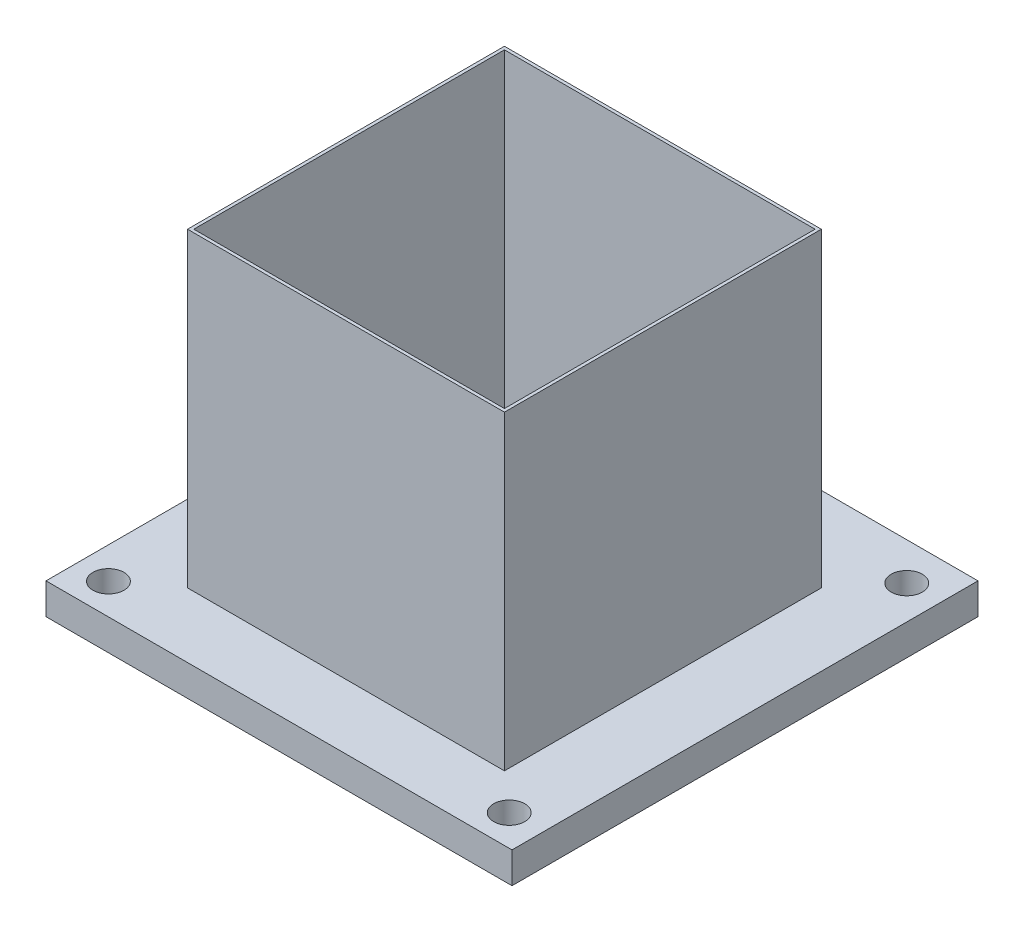
ISO-10303-21;
HEADER;
FILE_DESCRIPTION(('STEP AP214'),'2;1');
FILE_NAME('part.step','',(''),(''),'','','');
FILE_SCHEMA(('AUTOMOTIVE_DESIGN { 1 0 10303 214 1 1 1 1 }'));
ENDSEC;
DATA;
#1=APPLICATION_CONTEXT('core data for automotive mechanical design processes');
#2=APPLICATION_PROTOCOL_DEFINITION('international standard','automotive_design',2000,#1);
#3=PRODUCT_CONTEXT('',#1,'mechanical');
#4=PRODUCT('Part','Part','',(#3));
#5=PRODUCT_RELATED_PRODUCT_CATEGORY('part','',(#4));
#6=PRODUCT_DEFINITION_FORMATION('','',#4);
#7=PRODUCT_DEFINITION_CONTEXT('part definition',#1,'design');
#8=PRODUCT_DEFINITION('design','',#6,#7);
#9=PRODUCT_DEFINITION_SHAPE('','',#8);
#10=(LENGTH_UNIT() NAMED_UNIT(*) SI_UNIT(.MILLI.,.METRE.));
#11=(NAMED_UNIT(*) PLANE_ANGLE_UNIT() SI_UNIT($,.RADIAN.));
#12=(NAMED_UNIT(*) SI_UNIT($,.STERADIAN.) SOLID_ANGLE_UNIT());
#13=UNCERTAINTY_MEASURE_WITH_UNIT(LENGTH_MEASURE(1.E-05),#10,'distance_accuracy_value','');
#14=(GEOMETRIC_REPRESENTATION_CONTEXT(3) GLOBAL_UNCERTAINTY_ASSIGNED_CONTEXT((#13)) GLOBAL_UNIT_ASSIGNED_CONTEXT((#10,
#11,#12)) REPRESENTATION_CONTEXT('',''));
#15=CARTESIAN_POINT('',(0.,0.,0.));
#16=DIRECTION('',(0.,0.,1.));
#17=DIRECTION('',(1.,0.,0.));
#18=AXIS2_PLACEMENT_3D('',#15,#16,#17);
#19=CARTESIAN_POINT('',(0.,2.54,0.));
#20=DIRECTION('',(0.,-1.,0.));
#21=DIRECTION('',(0.,0.,-1.));
#22=AXIS2_PLACEMENT_3D('',#19,#20,#21);
#23=PLANE('',#22);
#24=CARTESIAN_POINT('',(2.58471853738159,2.54,-2.52040180034529));
#25=DIRECTION('',(0.,1.,0.));
#26=DIRECTION('',(0.,0.,1.));
#27=AXIS2_PLACEMENT_3D('',#24,#25,#26);
#28=CIRCLE('',#27,1.27);
#29=CARTESIAN_POINT('',(2.58471853738159,2.54,-1.25040180034529));
#30=VERTEX_POINT('',#29);
#31=EDGE_CURVE('E181',#30,#30,#28,.T.);
#32=ORIENTED_EDGE('',*,*,#31,.F.);
#33=EDGE_LOOP('',(#32));
#34=FACE_BOUND('',#33,.T.);
#35=CARTESIAN_POINT('',(35.3509562519498,2.54,-2.52040180034529));
#36=DIRECTION('',(0.,1.,0.));
#37=DIRECTION('',(0.,0.,1.));
#38=AXIS2_PLACEMENT_3D('',#35,#36,#37);
#39=CIRCLE('',#38,1.27);
#40=CARTESIAN_POINT('',(35.3509562519498,2.54,-1.25040180034529));
#41=VERTEX_POINT('',#40);
#42=EDGE_CURVE('E187',#41,#41,#39,.T.);
#43=ORIENTED_EDGE('',*,*,#42,.F.);
#44=EDGE_LOOP('',(#43));
#45=FACE_BOUND('',#44,.T.);
#46=CARTESIAN_POINT('',(35.3509562519498,2.54,-35.0229825900215));
#47=DIRECTION('',(0.,1.,0.));
#48=DIRECTION('',(0.,0.,1.));
#49=AXIS2_PLACEMENT_3D('',#46,#47,#48);
#50=CIRCLE('',#49,1.27);
#51=CARTESIAN_POINT('',(35.3509562519498,2.54,-33.7529825900215));
#52=VERTEX_POINT('',#51);
#53=EDGE_CURVE('E193',#52,#52,#50,.T.);
#54=ORIENTED_EDGE('',*,*,#53,.F.);
#55=EDGE_LOOP('',(#54));
#56=FACE_BOUND('',#55,.T.);
#57=CARTESIAN_POINT('',(2.58471853738159,2.54,-35.0229825900215));
#58=DIRECTION('',(0.,1.,0.));
#59=DIRECTION('',(0.,0.,1.));
#60=AXIS2_PLACEMENT_3D('',#57,#58,#59);
#61=CIRCLE('',#60,1.27);
#62=CARTESIAN_POINT('',(2.58471853738159,2.54,-33.7529825900215));
#63=VERTEX_POINT('',#62);
#64=EDGE_CURVE('E199',#63,#63,#61,.T.);
#65=ORIENTED_EDGE('',*,*,#64,.F.);
#66=EDGE_LOOP('',(#65));
#67=FACE_BOUND('',#66,.T.);
#68=DIRECTION('',(0.,0.,1.));
#69=VECTOR('',#68,1.);
#70=CARTESIAN_POINT('',(0.,2.54,0.));
#71=LINE('',#70,#69);
#72=CARTESIAN_POINT('',(0.,2.54,-38.1));
#73=VERTEX_POINT('',#72);
#74=CARTESIAN_POINT('',(0.,2.54,0.));
#75=VERTEX_POINT('',#74);
#76=EDGE_CURVE('E217',#73,#75,#71,.T.);
#77=ORIENTED_EDGE('',*,*,#76,.T.);
#78=DIRECTION('',(1.,0.,0.));
#79=VECTOR('',#78,1.);
#80=CARTESIAN_POINT('',(0.,2.54,0.));
#81=LINE('',#80,#79);
#82=CARTESIAN_POINT('',(38.1,2.54,0.));
#83=VERTEX_POINT('',#82);
#84=EDGE_CURVE('E220',#75,#83,#81,.T.);
#85=ORIENTED_EDGE('',*,*,#84,.T.);
#86=DIRECTION('',(0.,0.,-1.));
#87=VECTOR('',#86,1.);
#88=CARTESIAN_POINT('',(38.1,2.54,0.));
#89=LINE('',#88,#87);
#90=CARTESIAN_POINT('',(38.1,2.54,-38.1));
#91=VERTEX_POINT('',#90);
#92=EDGE_CURVE('E223',#83,#91,#89,.T.);
#93=ORIENTED_EDGE('',*,*,#92,.T.);
#94=DIRECTION('',(-1.,0.,0.));
#95=VECTOR('',#94,1.);
#96=CARTESIAN_POINT('',(0.,2.54,-38.1));
#97=LINE('',#96,#95);
#98=EDGE_CURVE('E225',#91,#73,#97,.T.);
#99=ORIENTED_EDGE('',*,*,#98,.T.);
#100=EDGE_LOOP('',(#77,#85,#93,#99));
#101=FACE_BOUND('',#100,.T.);
#102=DIRECTION('',(0.,0.,1.));
#103=VECTOR('',#102,1.);
#104=CARTESIAN_POINT('',(6.28776886791902,2.54,-31.1935027995673));
#105=LINE('',#104,#103);
#106=CARTESIAN_POINT('',(6.28776886791902,2.54,-31.1935027995673));
#107=VERTEX_POINT('',#106);
#108=CARTESIAN_POINT('',(6.28776886791902,2.54,-5.28550279956734));
#109=VERTEX_POINT('',#108);
#110=EDGE_CURVE('E152',#107,#109,#105,.T.);
#111=ORIENTED_EDGE('',*,*,#110,.F.);
#112=DIRECTION('',(-1.,0.,0.));
#113=VECTOR('',#112,1.);
#114=CARTESIAN_POINT('',(6.28776886791902,2.54,-31.1935027995673));
#115=LINE('',#114,#113);
#116=CARTESIAN_POINT('',(32.195768867919,2.54,-31.1935027995673));
#117=VERTEX_POINT('',#116);
#118=EDGE_CURVE('E157',#117,#107,#115,.T.);
#119=ORIENTED_EDGE('',*,*,#118,.F.);
#120=DIRECTION('',(0.,0.,-1.));
#121=VECTOR('',#120,1.);
#122=CARTESIAN_POINT('',(32.195768867919,2.54,-31.1935027995673));
#123=LINE('',#122,#121);
#124=CARTESIAN_POINT('',(32.195768867919,2.54,-5.28550279956734));
#125=VERTEX_POINT('',#124);
#126=EDGE_CURVE('E55',#125,#117,#123,.T.);
#127=ORIENTED_EDGE('',*,*,#126,.F.);
#128=DIRECTION('',(1.,0.,0.));
#129=VECTOR('',#128,1.);
#130=CARTESIAN_POINT('',(6.28776886791902,2.54,-5.28550279956734));
#131=LINE('',#130,#129);
#132=EDGE_CURVE('E50',#109,#125,#131,.T.);
#133=ORIENTED_EDGE('',*,*,#132,.F.);
#134=EDGE_LOOP('',(#111,#119,#127,#133));
#135=FACE_BOUND('',#134,.T.);
#136=ADVANCED_FACE('F35',(#34,#45,#56,#67,#101,#135),#23,.F.);
#137=CARTESIAN_POINT('',(0.,0.,0.));
#138=DIRECTION('',(0.,-1.,0.));
#139=DIRECTION('',(0.,0.,-1.));
#140=AXIS2_PLACEMENT_3D('',#137,#138,#139);
#141=PLANE('',#140);
#142=CARTESIAN_POINT('',(35.3509562519498,0.,-2.52040180034529));
#143=DIRECTION('',(0.,1.,0.));
#144=DIRECTION('',(0.,0.,1.));
#145=AXIS2_PLACEMENT_3D('',#142,#143,#144);
#146=CIRCLE('',#145,1.27);
#147=CARTESIAN_POINT('',(35.3509562519498,0.,-1.25040180034529));
#148=VERTEX_POINT('',#147);
#149=EDGE_CURVE('E184',#148,#148,#146,.T.);
#150=ORIENTED_EDGE('',*,*,#149,.T.);
#151=EDGE_LOOP('',(#150));
#152=FACE_BOUND('',#151,.T.);
#153=CARTESIAN_POINT('',(2.58471853738159,0.,-35.0229825900215));
#154=DIRECTION('',(0.,1.,0.));
#155=DIRECTION('',(0.,0.,1.));
#156=AXIS2_PLACEMENT_3D('',#153,#154,#155);
#157=CIRCLE('',#156,1.27);
#158=CARTESIAN_POINT('',(2.58471853738159,0.,-33.7529825900215));
#159=VERTEX_POINT('',#158);
#160=EDGE_CURVE('E196',#159,#159,#157,.T.);
#161=ORIENTED_EDGE('',*,*,#160,.T.);
#162=EDGE_LOOP('',(#161));
#163=FACE_BOUND('',#162,.T.);
#164=DIRECTION('',(0.,0.,1.));
#165=VECTOR('',#164,1.);
#166=CARTESIAN_POINT('',(0.,0.,0.));
#167=LINE('',#166,#165);
#168=CARTESIAN_POINT('',(0.,0.,-38.1));
#169=VERTEX_POINT('',#168);
#170=CARTESIAN_POINT('',(0.,0.,0.));
#171=VERTEX_POINT('',#170);
#172=EDGE_CURVE('E132',#169,#171,#167,.T.);
#173=ORIENTED_EDGE('',*,*,#172,.F.);
#174=DIRECTION('',(-1.,0.,0.));
#175=VECTOR('',#174,1.);
#176=CARTESIAN_POINT('',(0.,0.,-38.1));
#177=LINE('',#176,#175);
#178=CARTESIAN_POINT('',(38.1,0.,-38.1));
#179=VERTEX_POINT('',#178);
#180=EDGE_CURVE('E221',#179,#169,#177,.T.);
#181=ORIENTED_EDGE('',*,*,#180,.F.);
#182=DIRECTION('',(0.,0.,-1.));
#183=VECTOR('',#182,1.);
#184=CARTESIAN_POINT('',(38.1,0.,0.));
#185=LINE('',#184,#183);
#186=CARTESIAN_POINT('',(38.1,0.,0.));
#187=VERTEX_POINT('',#186);
#188=EDGE_CURVE('E232',#187,#179,#185,.T.);
#189=ORIENTED_EDGE('',*,*,#188,.F.);
#190=DIRECTION('',(1.,0.,0.));
#191=VECTOR('',#190,1.);
#192=CARTESIAN_POINT('',(0.,0.,0.));
#193=LINE('',#192,#191);
#194=EDGE_CURVE('E230',#171,#187,#193,.T.);
#195=ORIENTED_EDGE('',*,*,#194,.F.);
#196=EDGE_LOOP('',(#173,#181,#189,#195));
#197=FACE_BOUND('',#196,.T.);
#198=DIRECTION('',(-1.,0.,0.));
#199=VECTOR('',#198,1.);
#200=CARTESIAN_POINT('',(6.54176886791902,0.,-30.9395027995673));
#201=LINE('',#200,#199);
#202=CARTESIAN_POINT('',(31.941768867919,0.,-30.9395027995673));
#203=VERTEX_POINT('',#202);
#204=CARTESIAN_POINT('',(6.54176886791902,0.,-30.9395027995673));
#205=VERTEX_POINT('',#204);
#206=EDGE_CURVE('E210',#203,#205,#201,.T.);
#207=ORIENTED_EDGE('',*,*,#206,.T.);
#208=DIRECTION('',(0.,0.,1.));
#209=VECTOR('',#208,1.);
#210=CARTESIAN_POINT('',(6.54176886791902,0.,-30.9395027995673));
#211=LINE('',#210,#209);
#212=CARTESIAN_POINT('',(6.54176886791902,0.,-5.53950279956734));
#213=VERTEX_POINT('',#212);
#214=EDGE_CURVE('E202',#205,#213,#211,.T.);
#215=ORIENTED_EDGE('',*,*,#214,.T.);
#216=DIRECTION('',(1.,0.,0.));
#217=VECTOR('',#216,1.);
#218=CARTESIAN_POINT('',(6.54176886791902,0.,-5.53950279956734));
#219=LINE('',#218,#217);
#220=CARTESIAN_POINT('',(31.941768867919,0.,-5.53950279956734));
#221=VERTEX_POINT('',#220);
#222=EDGE_CURVE('E129',#213,#221,#219,.T.);
#223=ORIENTED_EDGE('',*,*,#222,.T.);
#224=DIRECTION('',(0.,0.,-1.));
#225=VECTOR('',#224,1.);
#226=CARTESIAN_POINT('',(31.941768867919,0.,-30.9395027995673));
#227=LINE('',#226,#225);
#228=EDGE_CURVE('E207',#221,#203,#227,.T.);
#229=ORIENTED_EDGE('',*,*,#228,.T.);
#230=EDGE_LOOP('',(#207,#215,#223,#229));
#231=FACE_BOUND('',#230,.T.);
#232=CARTESIAN_POINT('',(35.3509562519498,0.,-35.0229825900215));
#233=DIRECTION('',(0.,1.,0.));
#234=DIRECTION('',(0.,0.,1.));
#235=AXIS2_PLACEMENT_3D('',#232,#233,#234);
#236=CIRCLE('',#235,1.27);
#237=CARTESIAN_POINT('',(35.3509562519498,0.,-33.7529825900215));
#238=VERTEX_POINT('',#237);
#239=EDGE_CURVE('E190',#238,#238,#236,.T.);
#240=ORIENTED_EDGE('',*,*,#239,.T.);
#241=EDGE_LOOP('',(#240));
#242=FACE_BOUND('',#241,.T.);
#243=CARTESIAN_POINT('',(2.58471853738159,0.,-2.52040180034529));
#244=DIRECTION('',(0.,1.,0.));
#245=DIRECTION('',(0.,0.,1.));
#246=AXIS2_PLACEMENT_3D('',#243,#244,#245);
#247=CIRCLE('',#246,1.27);
#248=CARTESIAN_POINT('',(2.58471853738159,0.,-1.25040180034529));
#249=VERTEX_POINT('',#248);
#250=EDGE_CURVE('E180',#249,#249,#247,.T.);
#251=ORIENTED_EDGE('',*,*,#250,.T.);
#252=EDGE_LOOP('',(#251));
#253=FACE_BOUND('',#252,.T.);
#254=ADVANCED_FACE('F250',(#152,#163,#197,#231,#242,#253),#141,.T.);
#255=CARTESIAN_POINT('',(0.,2.54,0.));
#256=DIRECTION('',(1.,0.,0.));
#257=DIRECTION('',(0.,0.,-1.));
#258=AXIS2_PLACEMENT_3D('',#255,#256,#257);
#259=PLANE('',#258);
#260=ORIENTED_EDGE('',*,*,#172,.T.);
#261=DIRECTION('',(0.,-1.,0.));
#262=VECTOR('',#261,1.);
#263=CARTESIAN_POINT('',(0.,2.54,0.));
#264=LINE('',#263,#262);
#265=EDGE_CURVE('E11',#75,#171,#264,.T.);
#266=ORIENTED_EDGE('',*,*,#265,.F.);
#267=ORIENTED_EDGE('',*,*,#76,.F.);
#268=DIRECTION('',(0.,-1.,0.));
#269=VECTOR('',#268,1.);
#270=CARTESIAN_POINT('',(0.,2.54,-38.1));
#271=LINE('',#270,#269);
#272=EDGE_CURVE('E227',#73,#169,#271,.T.);
#273=ORIENTED_EDGE('',*,*,#272,.T.);
#274=EDGE_LOOP('',(#260,#266,#267,#273));
#275=FACE_BOUND('',#274,.T.);
#276=ADVANCED_FACE('F37',(#275),#259,.F.);
#277=CARTESIAN_POINT('',(0.,2.54,0.));
#278=DIRECTION('',(0.,0.,-1.));
#279=DIRECTION('',(-1.,0.,0.));
#280=AXIS2_PLACEMENT_3D('',#277,#278,#279);
#281=PLANE('',#280);
#282=ORIENTED_EDGE('',*,*,#194,.T.);
#283=DIRECTION('',(0.,-1.,0.));
#284=VECTOR('',#283,1.);
#285=CARTESIAN_POINT('',(38.1,2.54,0.));
#286=LINE('',#285,#284);
#287=EDGE_CURVE('E43',#83,#187,#286,.T.);
#288=ORIENTED_EDGE('',*,*,#287,.F.);
#289=ORIENTED_EDGE('',*,*,#84,.F.);
#290=ORIENTED_EDGE('',*,*,#265,.T.);
#291=EDGE_LOOP('',(#282,#288,#289,#290));
#292=FACE_BOUND('',#291,.T.);
#293=ADVANCED_FACE('F260',(#292),#281,.F.);
#294=CARTESIAN_POINT('',(38.1,2.54,0.));
#295=DIRECTION('',(-1.,0.,0.));
#296=DIRECTION('',(0.,0.,1.));
#297=AXIS2_PLACEMENT_3D('',#294,#295,#296);
#298=PLANE('',#297);
#299=ORIENTED_EDGE('',*,*,#188,.T.);
#300=DIRECTION('',(0.,-1.,0.));
#301=VECTOR('',#300,1.);
#302=CARTESIAN_POINT('',(38.1,2.54,-38.1));
#303=LINE('',#302,#301);
#304=EDGE_CURVE('E237',#91,#179,#303,.T.);
#305=ORIENTED_EDGE('',*,*,#304,.F.);
#306=ORIENTED_EDGE('',*,*,#92,.F.);
#307=ORIENTED_EDGE('',*,*,#287,.T.);
#308=EDGE_LOOP('',(#299,#305,#306,#307));
#309=FACE_BOUND('',#308,.T.);
#310=ADVANCED_FACE('F244',(#309),#298,.F.);
#311=CARTESIAN_POINT('',(0.,2.54,-38.1));
#312=DIRECTION('',(0.,0.,1.));
#313=DIRECTION('',(1.,0.,0.));
#314=AXIS2_PLACEMENT_3D('',#311,#312,#313);
#315=PLANE('',#314);
#316=ORIENTED_EDGE('',*,*,#180,.T.);
#317=ORIENTED_EDGE('',*,*,#272,.F.);
#318=ORIENTED_EDGE('',*,*,#98,.F.);
#319=ORIENTED_EDGE('',*,*,#304,.T.);
#320=EDGE_LOOP('',(#316,#317,#318,#319));
#321=FACE_BOUND('',#320,.T.);
#322=ADVANCED_FACE('F254',(#321),#315,.F.);
#323=CARTESIAN_POINT('',(6.54176886791902,2.54,-30.9395027995673));
#324=DIRECTION('',(1.,0.,0.));
#325=DIRECTION('',(0.,0.,-1.));
#326=AXIS2_PLACEMENT_3D('',#323,#324,#325);
#327=PLANE('',#326);
#328=ORIENTED_EDGE('',*,*,#214,.F.);
#329=DIRECTION('',(0.,-1.,0.));
#330=VECTOR('',#329,1.);
#331=CARTESIAN_POINT('',(6.54176886791902,2.54,-30.9395027995673));
#332=LINE('',#331,#330);
#333=CARTESIAN_POINT('',(6.54176886791902,27.94,-30.9395027995673));
#334=VERTEX_POINT('',#333);
#335=EDGE_CURVE('E139',#334,#205,#332,.T.);
#336=ORIENTED_EDGE('',*,*,#335,.F.);
#337=DIRECTION('',(0.,0.,1.));
#338=VECTOR('',#337,1.);
#339=CARTESIAN_POINT('',(6.54176886791902,27.94,-30.9395027995673));
#340=LINE('',#339,#338);
#341=CARTESIAN_POINT('',(6.54176886791902,27.94,-5.53950279956734));
#342=VERTEX_POINT('',#341);
#343=EDGE_CURVE('E136',#334,#342,#340,.T.);
#344=ORIENTED_EDGE('',*,*,#343,.T.);
#345=DIRECTION('',(0.,-1.,0.));
#346=VECTOR('',#345,1.);
#347=CARTESIAN_POINT('',(6.54176886791902,2.54,-5.53950279956734));
#348=LINE('',#347,#346);
#349=EDGE_CURVE('E122',#342,#213,#348,.T.);
#350=ORIENTED_EDGE('',*,*,#349,.T.);
#351=EDGE_LOOP('',(#328,#336,#344,#350));
#352=FACE_BOUND('',#351,.T.);
#353=ADVANCED_FACE('F137',(#352),#327,.T.);
#354=CARTESIAN_POINT('',(6.54176886791902,2.54,-5.53950279956734));
#355=DIRECTION('',(0.,0.,-1.));
#356=DIRECTION('',(-1.,0.,0.));
#357=AXIS2_PLACEMENT_3D('',#354,#355,#356);
#358=PLANE('',#357);
#359=ORIENTED_EDGE('',*,*,#222,.F.);
#360=ORIENTED_EDGE('',*,*,#349,.F.);
#361=DIRECTION('',(1.,0.,0.));
#362=VECTOR('',#361,1.);
#363=CARTESIAN_POINT('',(6.54176886791902,27.94,-5.53950279956734));
#364=LINE('',#363,#362);
#365=CARTESIAN_POINT('',(31.941768867919,27.94,-5.53950279956734));
#366=VERTEX_POINT('',#365);
#367=EDGE_CURVE('E126',#342,#366,#364,.T.);
#368=ORIENTED_EDGE('',*,*,#367,.T.);
#369=DIRECTION('',(0.,-1.,0.));
#370=VECTOR('',#369,1.);
#371=CARTESIAN_POINT('',(31.941768867919,2.54,-5.53950279956734));
#372=LINE('',#371,#370);
#373=EDGE_CURVE('E133',#366,#221,#372,.T.);
#374=ORIENTED_EDGE('',*,*,#373,.T.);
#375=EDGE_LOOP('',(#359,#360,#368,#374));
#376=FACE_BOUND('',#375,.T.);
#377=ADVANCED_FACE('F124',(#376),#358,.T.);
#378=CARTESIAN_POINT('',(31.941768867919,2.54,-30.9395027995673));
#379=DIRECTION('',(-1.,0.,0.));
#380=DIRECTION('',(0.,0.,1.));
#381=AXIS2_PLACEMENT_3D('',#378,#379,#380);
#382=PLANE('',#381);
#383=ORIENTED_EDGE('',*,*,#228,.F.);
#384=ORIENTED_EDGE('',*,*,#373,.F.);
#385=DIRECTION('',(0.,0.,-1.));
#386=VECTOR('',#385,1.);
#387=CARTESIAN_POINT('',(31.941768867919,27.94,-30.9395027995673));
#388=LINE('',#387,#386);
#389=CARTESIAN_POINT('',(31.941768867919,27.94,-30.9395027995673));
#390=VERTEX_POINT('',#389);
#391=EDGE_CURVE('E146',#366,#390,#388,.T.);
#392=ORIENTED_EDGE('',*,*,#391,.T.);
#393=DIRECTION('',(0.,-1.,0.));
#394=VECTOR('',#393,1.);
#395=CARTESIAN_POINT('',(31.941768867919,2.54,-30.9395027995673));
#396=LINE('',#395,#394);
#397=EDGE_CURVE('E214',#390,#203,#396,.T.);
#398=ORIENTED_EDGE('',*,*,#397,.T.);
#399=EDGE_LOOP('',(#383,#384,#392,#398));
#400=FACE_BOUND('',#399,.T.);
#401=ADVANCED_FACE('F287',(#400),#382,.T.);
#402=CARTESIAN_POINT('',(6.54176886791902,2.54,-30.9395027995673));
#403=DIRECTION('',(0.,0.,1.));
#404=DIRECTION('',(1.,0.,0.));
#405=AXIS2_PLACEMENT_3D('',#402,#403,#404);
#406=PLANE('',#405);
#407=ORIENTED_EDGE('',*,*,#206,.F.);
#408=ORIENTED_EDGE('',*,*,#397,.F.);
#409=DIRECTION('',(-1.,0.,0.));
#410=VECTOR('',#409,1.);
#411=CARTESIAN_POINT('',(6.54176886791902,27.94,-30.9395027995673));
#412=LINE('',#411,#410);
#413=EDGE_CURVE('E148',#390,#334,#412,.T.);
#414=ORIENTED_EDGE('',*,*,#413,.T.);
#415=ORIENTED_EDGE('',*,*,#335,.T.);
#416=EDGE_LOOP('',(#407,#408,#414,#415));
#417=FACE_BOUND('',#416,.T.);
#418=ADVANCED_FACE('F291',(#417),#406,.T.);
#419=CARTESIAN_POINT('',(2.58471853738159,2.54,-35.0229825900215));
#420=DIRECTION('',(0.,-1.,0.));
#421=DIRECTION('',(0.,0.,-1.));
#422=AXIS2_PLACEMENT_3D('',#419,#420,#421);
#423=CYLINDRICAL_SURFACE('',#422,1.27);
#424=ORIENTED_EDGE('',*,*,#64,.T.);
#425=EDGE_LOOP('',(#424));
#426=FACE_BOUND('',#425,.T.);
#427=ORIENTED_EDGE('',*,*,#160,.F.);
#428=EDGE_LOOP('',(#427));
#429=FACE_BOUND('',#428,.T.);
#430=ADVANCED_FACE('F297',(#426,#429),#423,.F.);
#431=CARTESIAN_POINT('',(35.3509562519498,2.54,-35.0229825900215));
#432=DIRECTION('',(0.,-1.,0.));
#433=DIRECTION('',(0.,0.,-1.));
#434=AXIS2_PLACEMENT_3D('',#431,#432,#433);
#435=CYLINDRICAL_SURFACE('',#434,1.27);
#436=ORIENTED_EDGE('',*,*,#53,.T.);
#437=EDGE_LOOP('',(#436));
#438=FACE_BOUND('',#437,.T.);
#439=ORIENTED_EDGE('',*,*,#239,.F.);
#440=EDGE_LOOP('',(#439));
#441=FACE_BOUND('',#440,.T.);
#442=ADVANCED_FACE('F301',(#438,#441),#435,.F.);
#443=CARTESIAN_POINT('',(35.3509562519498,2.54,-2.52040180034529));
#444=DIRECTION('',(0.,-1.,0.));
#445=DIRECTION('',(0.,0.,-1.));
#446=AXIS2_PLACEMENT_3D('',#443,#444,#445);
#447=CYLINDRICAL_SURFACE('',#446,1.27);
#448=ORIENTED_EDGE('',*,*,#42,.T.);
#449=EDGE_LOOP('',(#448));
#450=FACE_BOUND('',#449,.T.);
#451=ORIENTED_EDGE('',*,*,#149,.F.);
#452=EDGE_LOOP('',(#451));
#453=FACE_BOUND('',#452,.T.);
#454=ADVANCED_FACE('F305',(#450,#453),#447,.F.);
#455=CARTESIAN_POINT('',(2.58471853738159,2.54,-2.52040180034529));
#456=DIRECTION('',(0.,-1.,0.));
#457=DIRECTION('',(0.,0.,-1.));
#458=AXIS2_PLACEMENT_3D('',#455,#456,#457);
#459=CYLINDRICAL_SURFACE('',#458,1.27);
#460=ORIENTED_EDGE('',*,*,#31,.T.);
#461=EDGE_LOOP('',(#460));
#462=FACE_BOUND('',#461,.T.);
#463=ORIENTED_EDGE('',*,*,#250,.F.);
#464=EDGE_LOOP('',(#463));
#465=FACE_BOUND('',#464,.T.);
#466=ADVANCED_FACE('F309',(#462,#465),#459,.F.);
#467=CARTESIAN_POINT('',(0.,27.94,0.));
#468=DIRECTION('',(0.,1.,0.));
#469=DIRECTION('',(0.,0.,1.));
#470=AXIS2_PLACEMENT_3D('',#467,#468,#469);
#471=PLANE('',#470);
#472=DIRECTION('',(0.,0.,1.));
#473=VECTOR('',#472,1.);
#474=CARTESIAN_POINT('',(6.28776886791902,27.94,-31.1935027995673));
#475=LINE('',#474,#473);
#476=CARTESIAN_POINT('',(6.28776886791902,27.94,-31.1935027995673));
#477=VERTEX_POINT('',#476);
#478=CARTESIAN_POINT('',(6.28776886791902,27.94,-5.28550279956734));
#479=VERTEX_POINT('',#478);
#480=EDGE_CURVE('E153',#477,#479,#475,.T.);
#481=ORIENTED_EDGE('',*,*,#480,.T.);
#482=DIRECTION('',(1.,0.,0.));
#483=VECTOR('',#482,1.);
#484=CARTESIAN_POINT('',(6.28776886791902,27.94,-5.28550279956734));
#485=LINE('',#484,#483);
#486=CARTESIAN_POINT('',(32.195768867919,27.94,-5.28550279956734));
#487=VERTEX_POINT('',#486);
#488=EDGE_CURVE('E156',#479,#487,#485,.T.);
#489=ORIENTED_EDGE('',*,*,#488,.T.);
#490=DIRECTION('',(0.,0.,-1.));
#491=VECTOR('',#490,1.);
#492=CARTESIAN_POINT('',(32.195768867919,27.94,-31.1935027995673));
#493=LINE('',#492,#491);
#494=CARTESIAN_POINT('',(32.195768867919,27.94,-31.1935027995673));
#495=VERTEX_POINT('',#494);
#496=EDGE_CURVE('E159',#487,#495,#493,.T.);
#497=ORIENTED_EDGE('',*,*,#496,.T.);
#498=DIRECTION('',(-1.,0.,0.));
#499=VECTOR('',#498,1.);
#500=CARTESIAN_POINT('',(6.28776886791902,27.94,-31.1935027995673));
#501=LINE('',#500,#499);
#502=EDGE_CURVE('E161',#495,#477,#501,.T.);
#503=ORIENTED_EDGE('',*,*,#502,.T.);
#504=EDGE_LOOP('',(#481,#489,#497,#503));
#505=FACE_BOUND('',#504,.T.);
#506=ORIENTED_EDGE('',*,*,#367,.F.);
#507=ORIENTED_EDGE('',*,*,#343,.F.);
#508=ORIENTED_EDGE('',*,*,#413,.F.);
#509=ORIENTED_EDGE('',*,*,#391,.F.);
#510=EDGE_LOOP('',(#506,#507,#508,#509));
#511=FACE_BOUND('',#510,.T.);
#512=ADVANCED_FACE('F144',(#505,#511),#471,.T.);
#513=CARTESIAN_POINT('',(6.28776886791902,27.94,-31.1935027995673));
#514=DIRECTION('',(1.,0.,0.));
#515=DIRECTION('',(0.,0.,-1.));
#516=AXIS2_PLACEMENT_3D('',#513,#514,#515);
#517=PLANE('',#516);
#518=ORIENTED_EDGE('',*,*,#110,.T.);
#519=DIRECTION('',(0.,-1.,0.));
#520=VECTOR('',#519,1.);
#521=CARTESIAN_POINT('',(6.28776886791902,27.94,-5.28550279956734));
#522=LINE('',#521,#520);
#523=EDGE_CURVE('E178',#479,#109,#522,.T.);
#524=ORIENTED_EDGE('',*,*,#523,.F.);
#525=ORIENTED_EDGE('',*,*,#480,.F.);
#526=DIRECTION('',(0.,-1.,0.));
#527=VECTOR('',#526,1.);
#528=CARTESIAN_POINT('',(6.28776886791902,27.94,-31.1935027995673));
#529=LINE('',#528,#527);
#530=EDGE_CURVE('E163',#477,#107,#529,.T.);
#531=ORIENTED_EDGE('',*,*,#530,.T.);
#532=EDGE_LOOP('',(#518,#524,#525,#531));
#533=FACE_BOUND('',#532,.T.);
#534=ADVANCED_FACE('F314',(#533),#517,.F.);
#535=CARTESIAN_POINT('',(6.28776886791902,27.94,-5.28550279956734));
#536=DIRECTION('',(0.,0.,-1.));
#537=DIRECTION('',(-1.,0.,0.));
#538=AXIS2_PLACEMENT_3D('',#535,#536,#537);
#539=PLANE('',#538);
#540=ORIENTED_EDGE('',*,*,#132,.T.);
#541=DIRECTION('',(0.,-1.,0.));
#542=VECTOR('',#541,1.);
#543=CARTESIAN_POINT('',(32.195768867919,27.94,-5.28550279956734));
#544=LINE('',#543,#542);
#545=EDGE_CURVE('E175',#487,#125,#544,.T.);
#546=ORIENTED_EDGE('',*,*,#545,.F.);
#547=ORIENTED_EDGE('',*,*,#488,.F.);
#548=ORIENTED_EDGE('',*,*,#523,.T.);
#549=EDGE_LOOP('',(#540,#546,#547,#548));
#550=FACE_BOUND('',#549,.T.);
#551=ADVANCED_FACE('F317',(#550),#539,.F.);
#552=CARTESIAN_POINT('',(32.195768867919,27.94,-31.1935027995673));
#553=DIRECTION('',(-1.,0.,0.));
#554=DIRECTION('',(0.,0.,1.));
#555=AXIS2_PLACEMENT_3D('',#552,#553,#554);
#556=PLANE('',#555);
#557=ORIENTED_EDGE('',*,*,#126,.T.);
#558=DIRECTION('',(0.,-1.,0.));
#559=VECTOR('',#558,1.);
#560=CARTESIAN_POINT('',(32.195768867919,27.94,-31.1935027995673));
#561=LINE('',#560,#559);
#562=EDGE_CURVE('E172',#495,#117,#561,.T.);
#563=ORIENTED_EDGE('',*,*,#562,.F.);
#564=ORIENTED_EDGE('',*,*,#496,.F.);
#565=ORIENTED_EDGE('',*,*,#545,.T.);
#566=EDGE_LOOP('',(#557,#563,#564,#565));
#567=FACE_BOUND('',#566,.T.);
#568=ADVANCED_FACE('F321',(#567),#556,.F.);
#569=CARTESIAN_POINT('',(6.28776886791902,27.94,-31.1935027995673));
#570=DIRECTION('',(0.,0.,1.));
#571=DIRECTION('',(1.,0.,0.));
#572=AXIS2_PLACEMENT_3D('',#569,#570,#571);
#573=PLANE('',#572);
#574=ORIENTED_EDGE('',*,*,#118,.T.);
#575=ORIENTED_EDGE('',*,*,#530,.F.);
#576=ORIENTED_EDGE('',*,*,#502,.F.);
#577=ORIENTED_EDGE('',*,*,#562,.T.);
#578=EDGE_LOOP('',(#574,#575,#576,#577));
#579=FACE_BOUND('',#578,.T.);
#580=ADVANCED_FACE('F325',(#579),#573,.F.);
#581=CLOSED_SHELL('',(#136,#254,#276,#293,#310,#322,#353,#377,#401,#418,#430,#442,#454,#466,
#512,#534,#551,#568,#580));
#582=MANIFOLD_SOLID_BREP('B2',#581);
#583=ADVANCED_BREP_SHAPE_REPRESENTATION('',(#18,#582),#14);
#584=SHAPE_DEFINITION_REPRESENTATION(#9,#583);
ENDSEC;
END-ISO-10303-21;
